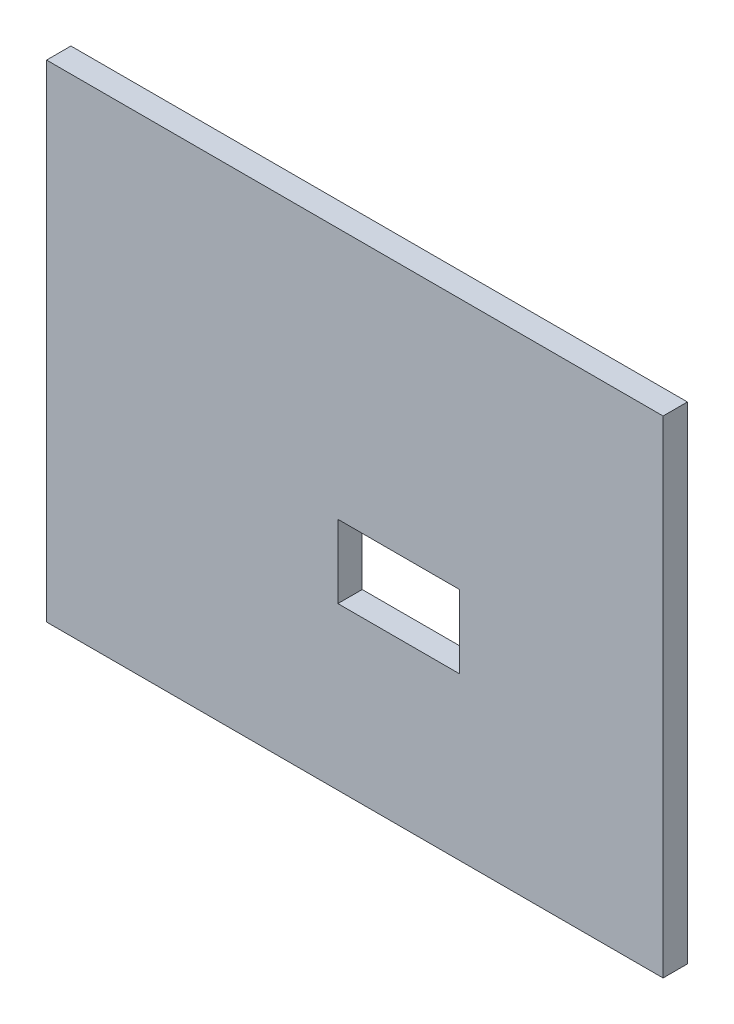
ISO-10303-21;
HEADER;
FILE_DESCRIPTION(('STEP AP214'),'2;1');
FILE_NAME('part.step','',(''),(''),'','','');
FILE_SCHEMA(('AUTOMOTIVE_DESIGN { 1 0 10303 214 1 1 1 1 }'));
ENDSEC;
DATA;
#1=APPLICATION_CONTEXT('core data for automotive mechanical design processes');
#2=APPLICATION_PROTOCOL_DEFINITION('international standard','automotive_design',2000,#1);
#3=PRODUCT_CONTEXT('',#1,'mechanical');
#4=PRODUCT('Part','Part','',(#3));
#5=PRODUCT_RELATED_PRODUCT_CATEGORY('part','',(#4));
#6=PRODUCT_DEFINITION_FORMATION('','',#4);
#7=PRODUCT_DEFINITION_CONTEXT('part definition',#1,'design');
#8=PRODUCT_DEFINITION('design','',#6,#7);
#9=PRODUCT_DEFINITION_SHAPE('','',#8);
#10=(LENGTH_UNIT() NAMED_UNIT(*) SI_UNIT(.MILLI.,.METRE.));
#11=(NAMED_UNIT(*) PLANE_ANGLE_UNIT() SI_UNIT($,.RADIAN.));
#12=(NAMED_UNIT(*) SI_UNIT($,.STERADIAN.) SOLID_ANGLE_UNIT());
#13=UNCERTAINTY_MEASURE_WITH_UNIT(LENGTH_MEASURE(1.E-05),#10,'distance_accuracy_value','');
#14=(GEOMETRIC_REPRESENTATION_CONTEXT(3) GLOBAL_UNCERTAINTY_ASSIGNED_CONTEXT((#13)) GLOBAL_UNIT_ASSIGNED_CONTEXT((#10,
#11,#12)) REPRESENTATION_CONTEXT('',''));
#15=CARTESIAN_POINT('',(0.,0.,0.));
#16=DIRECTION('',(0.,0.,1.));
#17=DIRECTION('',(1.,0.,0.));
#18=AXIS2_PLACEMENT_3D('',#15,#16,#17);
#19=CARTESIAN_POINT('',(38.,30.,3.));
#20=DIRECTION('',(-1.,0.,0.));
#21=DIRECTION('',(0.,0.,1.));
#22=AXIS2_PLACEMENT_3D('',#19,#20,#21);
#23=PLANE('',#22);
#24=DIRECTION('',(0.,1.,0.));
#25=VECTOR('',#24,1.);
#26=CARTESIAN_POINT('',(38.,30.,0.));
#27=LINE('',#26,#25);
#28=CARTESIAN_POINT('',(38.,-30.,0.));
#29=VERTEX_POINT('',#28);
#30=CARTESIAN_POINT('',(38.,30.,0.));
#31=VERTEX_POINT('',#30);
#32=EDGE_CURVE('E130',#29,#31,#27,.T.);
#33=ORIENTED_EDGE('',*,*,#32,.T.);
#34=DIRECTION('',(0.,0.,-1.));
#35=VECTOR('',#34,1.);
#36=CARTESIAN_POINT('',(38.,30.,3.));
#37=LINE('',#36,#35);
#38=CARTESIAN_POINT('',(38.,30.,3.));
#39=VERTEX_POINT('',#38);
#40=EDGE_CURVE('E11',#39,#31,#37,.T.);
#41=ORIENTED_EDGE('',*,*,#40,.F.);
#42=DIRECTION('',(0.,1.,0.));
#43=VECTOR('',#42,1.);
#44=CARTESIAN_POINT('',(38.,30.,3.));
#45=LINE('',#44,#43);
#46=CARTESIAN_POINT('',(38.,-30.,3.));
#47=VERTEX_POINT('',#46);
#48=EDGE_CURVE('E134',#47,#39,#45,.T.);
#49=ORIENTED_EDGE('',*,*,#48,.F.);
#50=DIRECTION('',(0.,0.,-1.));
#51=VECTOR('',#50,1.);
#52=CARTESIAN_POINT('',(38.,-30.,3.));
#53=LINE('',#52,#51);
#54=EDGE_CURVE('E144',#47,#29,#53,.T.);
#55=ORIENTED_EDGE('',*,*,#54,.T.);
#56=EDGE_LOOP('',(#33,#41,#49,#55));
#57=FACE_BOUND('',#56,.T.);
#58=ADVANCED_FACE('F33',(#57),#23,.F.);
#59=CARTESIAN_POINT('',(-38.,30.,3.));
#60=DIRECTION('',(0.,-1.,0.));
#61=DIRECTION('',(0.,0.,-1.));
#62=AXIS2_PLACEMENT_3D('',#59,#60,#61);
#63=PLANE('',#62);
#64=DIRECTION('',(-1.,0.,0.));
#65=VECTOR('',#64,1.);
#66=CARTESIAN_POINT('',(-38.,30.,0.));
#67=LINE('',#66,#65);
#68=CARTESIAN_POINT('',(-38.,30.,0.));
#69=VERTEX_POINT('',#68);
#70=EDGE_CURVE('E147',#31,#69,#67,.T.);
#71=ORIENTED_EDGE('',*,*,#70,.T.);
#72=DIRECTION('',(0.,0.,-1.));
#73=VECTOR('',#72,1.);
#74=CARTESIAN_POINT('',(-38.,30.,3.));
#75=LINE('',#74,#73);
#76=CARTESIAN_POINT('',(-38.,30.,3.));
#77=VERTEX_POINT('',#76);
#78=EDGE_CURVE('E40',#77,#69,#75,.T.);
#79=ORIENTED_EDGE('',*,*,#78,.F.);
#80=DIRECTION('',(-1.,0.,0.));
#81=VECTOR('',#80,1.);
#82=CARTESIAN_POINT('',(-38.,30.,3.));
#83=LINE('',#82,#81);
#84=EDGE_CURVE('E137',#39,#77,#83,.T.);
#85=ORIENTED_EDGE('',*,*,#84,.F.);
#86=ORIENTED_EDGE('',*,*,#40,.T.);
#87=EDGE_LOOP('',(#71,#79,#85,#86));
#88=FACE_BOUND('',#87,.T.);
#89=ADVANCED_FACE('F175',(#88),#63,.F.);
#90=CARTESIAN_POINT('',(-38.,30.,3.));
#91=DIRECTION('',(1.,0.,0.));
#92=DIRECTION('',(0.,1.,0.));
#93=AXIS2_PLACEMENT_3D('',#90,#91,#92);
#94=PLANE('',#93);
#95=DIRECTION('',(0.,-1.,0.));
#96=VECTOR('',#95,1.);
#97=CARTESIAN_POINT('',(-38.,30.,0.));
#98=LINE('',#97,#96);
#99=CARTESIAN_POINT('',(-38.,-30.,0.));
#100=VERTEX_POINT('',#99);
#101=EDGE_CURVE('E149',#69,#100,#98,.T.);
#102=ORIENTED_EDGE('',*,*,#101,.T.);
#103=DIRECTION('',(0.,0.,-1.));
#104=VECTOR('',#103,1.);
#105=CARTESIAN_POINT('',(-38.,-30.,3.));
#106=LINE('',#105,#104);
#107=CARTESIAN_POINT('',(-38.,-30.,3.));
#108=VERTEX_POINT('',#107);
#109=EDGE_CURVE('E154',#108,#100,#106,.T.);
#110=ORIENTED_EDGE('',*,*,#109,.F.);
#111=DIRECTION('',(0.,-1.,0.));
#112=VECTOR('',#111,1.);
#113=CARTESIAN_POINT('',(-38.,30.,3.));
#114=LINE('',#113,#112);
#115=EDGE_CURVE('E140',#77,#108,#114,.T.);
#116=ORIENTED_EDGE('',*,*,#115,.F.);
#117=ORIENTED_EDGE('',*,*,#78,.T.);
#118=EDGE_LOOP('',(#102,#110,#116,#117));
#119=FACE_BOUND('',#118,.T.);
#120=ADVANCED_FACE('F161',(#119),#94,.F.);
#121=CARTESIAN_POINT('',(-38.,-30.,3.));
#122=DIRECTION('',(0.,1.,0.));
#123=DIRECTION('',(0.,0.,1.));
#124=AXIS2_PLACEMENT_3D('',#121,#122,#123);
#125=PLANE('',#124);
#126=DIRECTION('',(1.,0.,0.));
#127=VECTOR('',#126,1.);
#128=CARTESIAN_POINT('',(-38.,-30.,0.));
#129=LINE('',#128,#127);
#130=EDGE_CURVE('E138',#100,#29,#129,.T.);
#131=ORIENTED_EDGE('',*,*,#130,.T.);
#132=ORIENTED_EDGE('',*,*,#54,.F.);
#133=DIRECTION('',(1.,0.,0.));
#134=VECTOR('',#133,1.);
#135=CARTESIAN_POINT('',(-38.,-30.,3.));
#136=LINE('',#135,#134);
#137=EDGE_CURVE('E142',#108,#47,#136,.T.);
#138=ORIENTED_EDGE('',*,*,#137,.F.);
#139=ORIENTED_EDGE('',*,*,#109,.T.);
#140=EDGE_LOOP('',(#131,#132,#138,#139));
#141=FACE_BOUND('',#140,.T.);
#142=ADVANCED_FACE('F168',(#141),#125,.F.);
#143=CARTESIAN_POINT('',(0.,0.,3.));
#144=DIRECTION('',(0.,0.,1.));
#145=DIRECTION('',(1.,0.,0.));
#146=AXIS2_PLACEMENT_3D('',#143,#144,#145);
#147=PLANE('',#146);
#148=DIRECTION('',(0.,1.,0.));
#149=VECTOR('',#148,1.);
#150=CARTESIAN_POINT('',(12.9106346206035,-1.0712644833294,3.));
#151=LINE('',#150,#149);
#152=CARTESIAN_POINT('',(12.9106346206035,-10.0712644833294,3.));
#153=VERTEX_POINT('',#152);
#154=CARTESIAN_POINT('',(12.9106346206035,-1.0712644833294,3.));
#155=VERTEX_POINT('',#154);
#156=EDGE_CURVE('E47',#153,#155,#151,.T.);
#157=ORIENTED_EDGE('',*,*,#156,.F.);
#158=DIRECTION('',(1.,0.,0.));
#159=VECTOR('',#158,1.);
#160=CARTESIAN_POINT('',(-2.08936537939651,-10.0712644833294,3.));
#161=LINE('',#160,#159);
#162=CARTESIAN_POINT('',(-2.08936537939651,-10.0712644833294,3.));
#163=VERTEX_POINT('',#162);
#164=EDGE_CURVE('E115',#163,#153,#161,.T.);
#165=ORIENTED_EDGE('',*,*,#164,.F.);
#166=DIRECTION('',(0.,-1.,0.));
#167=VECTOR('',#166,1.);
#168=CARTESIAN_POINT('',(-2.08936537939651,-1.0712644833294,3.));
#169=LINE('',#168,#167);
#170=CARTESIAN_POINT('',(-2.08936537939651,-1.0712644833294,3.));
#171=VERTEX_POINT('',#170);
#172=EDGE_CURVE('E118',#171,#163,#169,.T.);
#173=ORIENTED_EDGE('',*,*,#172,.F.);
#174=DIRECTION('',(-1.,0.,0.));
#175=VECTOR('',#174,1.);
#176=CARTESIAN_POINT('',(-2.08936537939651,-1.0712644833294,3.));
#177=LINE('',#176,#175);
#178=EDGE_CURVE('E124',#155,#171,#177,.T.);
#179=ORIENTED_EDGE('',*,*,#178,.F.);
#180=EDGE_LOOP('',(#157,#165,#173,#179));
#181=FACE_BOUND('',#180,.T.);
#182=ORIENTED_EDGE('',*,*,#48,.T.);
#183=ORIENTED_EDGE('',*,*,#84,.T.);
#184=ORIENTED_EDGE('',*,*,#115,.T.);
#185=ORIENTED_EDGE('',*,*,#137,.T.);
#186=EDGE_LOOP('',(#182,#183,#184,#185));
#187=FACE_BOUND('',#186,.T.);
#188=ADVANCED_FACE('F174',(#181,#187),#147,.T.);
#189=CARTESIAN_POINT('',(0.,0.,0.));
#190=DIRECTION('',(0.,0.,1.));
#191=DIRECTION('',(1.,0.,0.));
#192=AXIS2_PLACEMENT_3D('',#189,#190,#191);
#193=PLANE('',#192);
#194=DIRECTION('',(1.,0.,0.));
#195=VECTOR('',#194,1.);
#196=CARTESIAN_POINT('',(-2.08936537939651,-10.0712644833294,0.));
#197=LINE('',#196,#195);
#198=CARTESIAN_POINT('',(-2.08936537939651,-10.0712644833294,0.));
#199=VERTEX_POINT('',#198);
#200=CARTESIAN_POINT('',(12.9106346206035,-10.0712644833294,0.));
#201=VERTEX_POINT('',#200);
#202=EDGE_CURVE('E105',#199,#201,#197,.T.);
#203=ORIENTED_EDGE('',*,*,#202,.T.);
#204=DIRECTION('',(0.,1.,0.));
#205=VECTOR('',#204,1.);
#206=CARTESIAN_POINT('',(12.9106346206035,-1.0712644833294,0.));
#207=LINE('',#206,#205);
#208=CARTESIAN_POINT('',(12.9106346206035,-1.0712644833294,0.));
#209=VERTEX_POINT('',#208);
#210=EDGE_CURVE('E99',#201,#209,#207,.T.);
#211=ORIENTED_EDGE('',*,*,#210,.T.);
#212=DIRECTION('',(-1.,0.,0.));
#213=VECTOR('',#212,1.);
#214=CARTESIAN_POINT('',(-2.08936537939651,-1.0712644833294,0.));
#215=LINE('',#214,#213);
#216=CARTESIAN_POINT('',(-2.08936537939651,-1.0712644833294,0.));
#217=VERTEX_POINT('',#216);
#218=EDGE_CURVE('E108',#209,#217,#215,.T.);
#219=ORIENTED_EDGE('',*,*,#218,.T.);
#220=DIRECTION('',(0.,-1.,0.));
#221=VECTOR('',#220,1.);
#222=CARTESIAN_POINT('',(-2.08936537939651,-1.0712644833294,0.));
#223=LINE('',#222,#221);
#224=EDGE_CURVE('E55',#217,#199,#223,.T.);
#225=ORIENTED_EDGE('',*,*,#224,.T.);
#226=EDGE_LOOP('',(#203,#211,#219,#225));
#227=FACE_BOUND('',#226,.T.);
#228=ORIENTED_EDGE('',*,*,#32,.F.);
#229=ORIENTED_EDGE('',*,*,#130,.F.);
#230=ORIENTED_EDGE('',*,*,#101,.F.);
#231=ORIENTED_EDGE('',*,*,#70,.F.);
#232=EDGE_LOOP('',(#228,#229,#230,#231));
#233=FACE_BOUND('',#232,.T.);
#234=ADVANCED_FACE('F112',(#227,#233),#193,.F.);
#235=CARTESIAN_POINT('',(12.9106346206035,-1.0712644833294,0.));
#236=DIRECTION('',(1.,0.,0.));
#237=DIRECTION('',(0.,0.,-1.));
#238=AXIS2_PLACEMENT_3D('',#235,#236,#237);
#239=PLANE('',#238);
#240=ORIENTED_EDGE('',*,*,#156,.T.);
#241=DIRECTION('',(0.,0.,1.));
#242=VECTOR('',#241,1.);
#243=CARTESIAN_POINT('',(12.9106346206035,-1.0712644833294,0.));
#244=LINE('',#243,#242);
#245=EDGE_CURVE('E95',#209,#155,#244,.T.);
#246=ORIENTED_EDGE('',*,*,#245,.F.);
#247=ORIENTED_EDGE('',*,*,#210,.F.);
#248=DIRECTION('',(0.,0.,1.));
#249=VECTOR('',#248,1.);
#250=CARTESIAN_POINT('',(12.9106346206035,-10.0712644833294,0.));
#251=LINE('',#250,#249);
#252=EDGE_CURVE('E128',#201,#153,#251,.T.);
#253=ORIENTED_EDGE('',*,*,#252,.T.);
#254=EDGE_LOOP('',(#240,#246,#247,#253));
#255=FACE_BOUND('',#254,.T.);
#256=ADVANCED_FACE('F97',(#255),#239,.F.);
#257=CARTESIAN_POINT('',(-2.08936537939651,-10.0712644833294,0.));
#258=DIRECTION('',(0.,-1.,0.));
#259=DIRECTION('',(0.,0.,-1.));
#260=AXIS2_PLACEMENT_3D('',#257,#258,#259);
#261=PLANE('',#260);
#262=ORIENTED_EDGE('',*,*,#164,.T.);
#263=ORIENTED_EDGE('',*,*,#252,.F.);
#264=ORIENTED_EDGE('',*,*,#202,.F.);
#265=DIRECTION('',(0.,0.,1.));
#266=VECTOR('',#265,1.);
#267=CARTESIAN_POINT('',(-2.08936537939651,-10.0712644833294,0.));
#268=LINE('',#267,#266);
#269=EDGE_CURVE('E131',#199,#163,#268,.T.);
#270=ORIENTED_EDGE('',*,*,#269,.T.);
#271=EDGE_LOOP('',(#262,#263,#264,#270));
#272=FACE_BOUND('',#271,.T.);
#273=ADVANCED_FACE('F192',(#272),#261,.F.);
#274=CARTESIAN_POINT('',(-2.08936537939651,-1.0712644833294,0.));
#275=DIRECTION('',(-1.,0.,0.));
#276=DIRECTION('',(0.,-1.,0.));
#277=AXIS2_PLACEMENT_3D('',#274,#275,#276);
#278=PLANE('',#277);
#279=ORIENTED_EDGE('',*,*,#172,.T.);
#280=ORIENTED_EDGE('',*,*,#269,.F.);
#281=ORIENTED_EDGE('',*,*,#224,.F.);
#282=DIRECTION('',(0.,0.,1.));
#283=VECTOR('',#282,1.);
#284=CARTESIAN_POINT('',(-2.08936537939651,-1.0712644833294,0.));
#285=LINE('',#284,#283);
#286=EDGE_CURVE('E104',#217,#171,#285,.T.);
#287=ORIENTED_EDGE('',*,*,#286,.T.);
#288=EDGE_LOOP('',(#279,#280,#281,#287));
#289=FACE_BOUND('',#288,.T.);
#290=ADVANCED_FACE('F195',(#289),#278,.F.);
#291=CARTESIAN_POINT('',(-2.08936537939651,-1.0712644833294,0.));
#292=DIRECTION('',(0.,1.,0.));
#293=DIRECTION('',(0.,0.,1.));
#294=AXIS2_PLACEMENT_3D('',#291,#292,#293);
#295=PLANE('',#294);
#296=ORIENTED_EDGE('',*,*,#178,.T.);
#297=ORIENTED_EDGE('',*,*,#286,.F.);
#298=ORIENTED_EDGE('',*,*,#218,.F.);
#299=ORIENTED_EDGE('',*,*,#245,.T.);
#300=EDGE_LOOP('',(#296,#297,#298,#299));
#301=FACE_BOUND('',#300,.T.);
#302=ADVANCED_FACE('F109',(#301),#295,.F.);
#303=CLOSED_SHELL('',(#58,#89,#120,#142,#188,#234,#256,#273,#290,#302));
#304=MANIFOLD_SOLID_BREP('B2',#303);
#305=ADVANCED_BREP_SHAPE_REPRESENTATION('',(#18,#304),#14);
#306=SHAPE_DEFINITION_REPRESENTATION(#9,#305);
ENDSEC;
END-ISO-10303-21;
